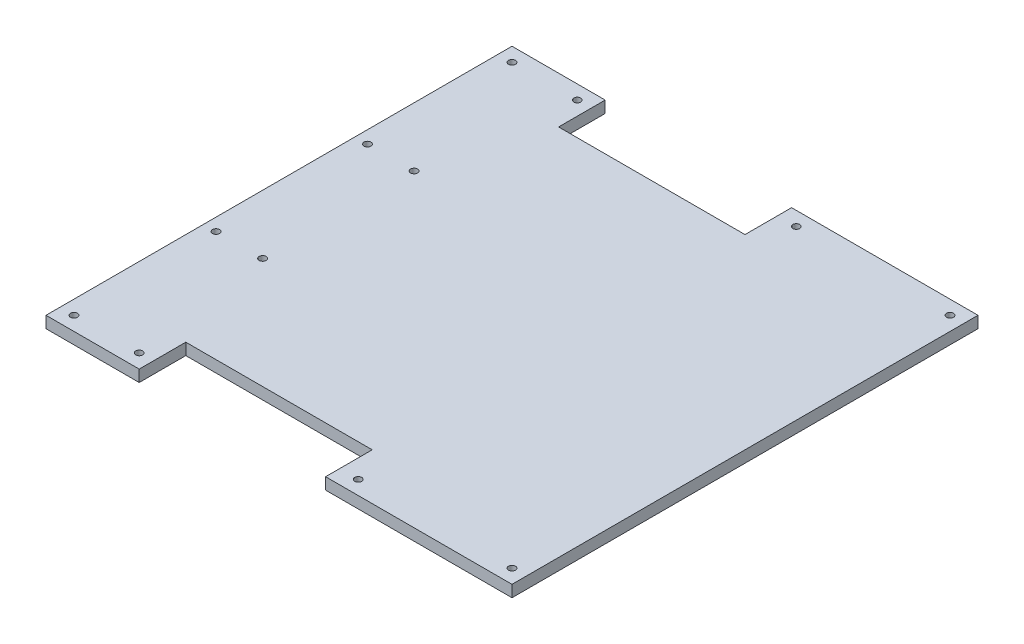
ISO-10303-21;
HEADER;
FILE_DESCRIPTION(('STEP AP214'),'2;1');
FILE_NAME('part.step','',(''),(''),'','','');
FILE_SCHEMA(('AUTOMOTIVE_DESIGN { 1 0 10303 214 1 1 1 1 }'));
ENDSEC;
DATA;
#1=APPLICATION_CONTEXT('core data for automotive mechanical design processes');
#2=APPLICATION_PROTOCOL_DEFINITION('international standard','automotive_design',2000,#1);
#3=PRODUCT_CONTEXT('',#1,'mechanical');
#4=PRODUCT('Part','Part','',(#3));
#5=PRODUCT_RELATED_PRODUCT_CATEGORY('part','',(#4));
#6=PRODUCT_DEFINITION_FORMATION('','',#4);
#7=PRODUCT_DEFINITION_CONTEXT('part definition',#1,'design');
#8=PRODUCT_DEFINITION('design','',#6,#7);
#9=PRODUCT_DEFINITION_SHAPE('','',#8);
#10=(LENGTH_UNIT() NAMED_UNIT(*) SI_UNIT(.MILLI.,.METRE.));
#11=(NAMED_UNIT(*) PLANE_ANGLE_UNIT() SI_UNIT($,.RADIAN.));
#12=(NAMED_UNIT(*) SI_UNIT($,.STERADIAN.) SOLID_ANGLE_UNIT());
#13=UNCERTAINTY_MEASURE_WITH_UNIT(LENGTH_MEASURE(1.E-05),#10,'distance_accuracy_value','');
#14=(GEOMETRIC_REPRESENTATION_CONTEXT(3) GLOBAL_UNCERTAINTY_ASSIGNED_CONTEXT((#13)) GLOBAL_UNIT_ASSIGNED_CONTEXT((#10,
#11,#12)) REPRESENTATION_CONTEXT('',''));
#15=CARTESIAN_POINT('',(0.,0.,0.));
#16=DIRECTION('',(0.,0.,1.));
#17=DIRECTION('',(1.,0.,0.));
#18=AXIS2_PLACEMENT_3D('',#15,#16,#17);
#19=CARTESIAN_POINT('',(27.547169811321,5.,-149.902137597475));
#20=DIRECTION('',(1.,0.,0.));
#21=DIRECTION('',(0.,0.,-1.));
#22=AXIS2_PLACEMENT_3D('',#19,#20,#21);
#23=PLANE('',#22);
#24=DIRECTION('',(0.,0.,1.));
#25=VECTOR('',#24,1.);
#26=CARTESIAN_POINT('',(27.547169811321,0.,-149.902137597475));
#27=LINE('',#26,#25);
#28=CARTESIAN_POINT('',(27.547169811321,0.,-149.902137597475));
#29=VERTEX_POINT('',#28);
#30=CARTESIAN_POINT('',(27.547169811321,0.,50.0978624025251));
#31=VERTEX_POINT('',#30);
#32=EDGE_CURVE('E159',#29,#31,#27,.T.);
#33=ORIENTED_EDGE('',*,*,#32,.T.);
#34=DIRECTION('',(0.,-1.,0.));
#35=VECTOR('',#34,1.);
#36=CARTESIAN_POINT('',(27.547169811321,5.,50.0978624025251));
#37=LINE('',#36,#35);
#38=CARTESIAN_POINT('',(27.547169811321,5.,50.0978624025251));
#39=VERTEX_POINT('',#38);
#40=EDGE_CURVE('E11',#39,#31,#37,.T.);
#41=ORIENTED_EDGE('',*,*,#40,.F.);
#42=DIRECTION('',(0.,0.,1.));
#43=VECTOR('',#42,1.);
#44=CARTESIAN_POINT('',(27.547169811321,5.,-149.902137597475));
#45=LINE('',#44,#43);
#46=CARTESIAN_POINT('',(27.547169811321,5.,-149.902137597475));
#47=VERTEX_POINT('',#46);
#48=EDGE_CURVE('E181',#47,#39,#45,.T.);
#49=ORIENTED_EDGE('',*,*,#48,.F.);
#50=DIRECTION('',(0.,-1.,0.));
#51=VECTOR('',#50,1.);
#52=CARTESIAN_POINT('',(27.547169811321,5.,-149.902137597475));
#53=LINE('',#52,#51);
#54=EDGE_CURVE('E155',#47,#29,#53,.T.);
#55=ORIENTED_EDGE('',*,*,#54,.T.);
#56=EDGE_LOOP('',(#33,#41,#49,#55));
#57=FACE_BOUND('',#56,.T.);
#58=ADVANCED_FACE('F37',(#57),#23,.F.);
#59=CARTESIAN_POINT('',(27.547169811321,5.,50.0978624025251));
#60=DIRECTION('',(0.,0.,-1.));
#61=DIRECTION('',(-1.,0.,0.));
#62=AXIS2_PLACEMENT_3D('',#59,#60,#61);
#63=PLANE('',#62);
#64=DIRECTION('',(1.,0.,0.));
#65=VECTOR('',#64,1.);
#66=CARTESIAN_POINT('',(27.547169811321,0.,50.0978624025251));
#67=LINE('',#66,#65);
#68=CARTESIAN_POINT('',(67.547169811321,0.,50.0978624025251));
#69=VERTEX_POINT('',#68);
#70=EDGE_CURVE('E162',#31,#69,#67,.T.);
#71=ORIENTED_EDGE('',*,*,#70,.T.);
#72=DIRECTION('',(0.,-1.,0.));
#73=VECTOR('',#72,1.);
#74=CARTESIAN_POINT('',(67.547169811321,5.,50.0978624025251));
#75=LINE('',#74,#73);
#76=CARTESIAN_POINT('',(67.547169811321,5.,50.0978624025251));
#77=VERTEX_POINT('',#76);
#78=EDGE_CURVE('E46',#77,#69,#75,.T.);
#79=ORIENTED_EDGE('',*,*,#78,.F.);
#80=DIRECTION('',(1.,0.,0.));
#81=VECTOR('',#80,1.);
#82=CARTESIAN_POINT('',(27.547169811321,5.,50.0978624025251));
#83=LINE('',#82,#81);
#84=EDGE_CURVE('E110',#39,#77,#83,.T.);
#85=ORIENTED_EDGE('',*,*,#84,.F.);
#86=ORIENTED_EDGE('',*,*,#40,.T.);
#87=EDGE_LOOP('',(#71,#79,#85,#86));
#88=FACE_BOUND('',#87,.T.);
#89=ADVANCED_FACE('F251',(#88),#63,.F.);
#90=CARTESIAN_POINT('',(67.547169811321,5.,30.0978624025251));
#91=DIRECTION('',(-1.,0.,0.));
#92=DIRECTION('',(0.,0.,1.));
#93=AXIS2_PLACEMENT_3D('',#90,#91,#92);
#94=PLANE('',#93);
#95=DIRECTION('',(0.,0.,-1.));
#96=VECTOR('',#95,1.);
#97=CARTESIAN_POINT('',(67.547169811321,0.,30.0978624025251));
#98=LINE('',#97,#96);
#99=CARTESIAN_POINT('',(67.547169811321,0.,30.0978624025251));
#100=VERTEX_POINT('',#99);
#101=EDGE_CURVE('E164',#69,#100,#98,.T.);
#102=ORIENTED_EDGE('',*,*,#101,.T.);
#103=DIRECTION('',(0.,-1.,0.));
#104=VECTOR('',#103,1.);
#105=CARTESIAN_POINT('',(67.547169811321,5.,30.0978624025251));
#106=LINE('',#105,#104);
#107=CARTESIAN_POINT('',(67.547169811321,5.,30.0978624025251));
#108=VERTEX_POINT('',#107);
#109=EDGE_CURVE('E200',#108,#100,#106,.T.);
#110=ORIENTED_EDGE('',*,*,#109,.F.);
#111=DIRECTION('',(0.,0.,-1.));
#112=VECTOR('',#111,1.);
#113=CARTESIAN_POINT('',(67.547169811321,5.,30.0978624025251));
#114=LINE('',#113,#112);
#115=EDGE_CURVE('E266',#77,#108,#114,.T.);
#116=ORIENTED_EDGE('',*,*,#115,.F.);
#117=ORIENTED_EDGE('',*,*,#78,.T.);
#118=EDGE_LOOP('',(#102,#110,#116,#117));
#119=FACE_BOUND('',#118,.T.);
#120=ADVANCED_FACE('F256',(#119),#94,.F.);
#121=CARTESIAN_POINT('',(147.547169811321,5.,30.0978624025251));
#122=DIRECTION('',(0.,0.,-1.));
#123=DIRECTION('',(-1.,0.,0.));
#124=AXIS2_PLACEMENT_3D('',#121,#122,#123);
#125=PLANE('',#124);
#126=DIRECTION('',(1.,0.,0.));
#127=VECTOR('',#126,1.);
#128=CARTESIAN_POINT('',(147.547169811321,0.,30.0978624025251));
#129=LINE('',#128,#127);
#130=CARTESIAN_POINT('',(147.547169811321,0.,30.0978624025251));
#131=VERTEX_POINT('',#130);
#132=EDGE_CURVE('E166',#100,#131,#129,.T.);
#133=ORIENTED_EDGE('',*,*,#132,.T.);
#134=DIRECTION('',(0.,-1.,0.));
#135=VECTOR('',#134,1.);
#136=CARTESIAN_POINT('',(147.547169811321,5.,30.0978624025251));
#137=LINE('',#136,#135);
#138=CARTESIAN_POINT('',(147.547169811321,5.,30.0978624025251));
#139=VERTEX_POINT('',#138);
#140=EDGE_CURVE('E197',#139,#131,#137,.T.);
#141=ORIENTED_EDGE('',*,*,#140,.F.);
#142=DIRECTION('',(1.,0.,0.));
#143=VECTOR('',#142,1.);
#144=CARTESIAN_POINT('',(147.547169811321,5.,30.0978624025251));
#145=LINE('',#144,#143);
#146=EDGE_CURVE('E268',#108,#139,#145,.T.);
#147=ORIENTED_EDGE('',*,*,#146,.F.);
#148=ORIENTED_EDGE('',*,*,#109,.T.);
#149=EDGE_LOOP('',(#133,#141,#147,#148));
#150=FACE_BOUND('',#149,.T.);
#151=ADVANCED_FACE('F306',(#150),#125,.F.);
#152=CARTESIAN_POINT('',(147.547169811321,5.,50.0978624025251));
#153=DIRECTION('',(1.,0.,0.));
#154=DIRECTION('',(0.,0.,-1.));
#155=AXIS2_PLACEMENT_3D('',#152,#153,#154);
#156=PLANE('',#155);
#157=DIRECTION('',(0.,0.,1.));
#158=VECTOR('',#157,1.);
#159=CARTESIAN_POINT('',(147.547169811321,0.,50.0978624025251));
#160=LINE('',#159,#158);
#161=CARTESIAN_POINT('',(147.547169811321,0.,50.0978624025251));
#162=VERTEX_POINT('',#161);
#163=EDGE_CURVE('E168',#131,#162,#160,.T.);
#164=ORIENTED_EDGE('',*,*,#163,.T.);
#165=DIRECTION('',(0.,-1.,0.));
#166=VECTOR('',#165,1.);
#167=CARTESIAN_POINT('',(147.547169811321,5.,50.0978624025251));
#168=LINE('',#167,#166);
#169=CARTESIAN_POINT('',(147.547169811321,5.,50.0978624025251));
#170=VERTEX_POINT('',#169);
#171=EDGE_CURVE('E194',#170,#162,#168,.T.);
#172=ORIENTED_EDGE('',*,*,#171,.F.);
#173=DIRECTION('',(0.,0.,1.));
#174=VECTOR('',#173,1.);
#175=CARTESIAN_POINT('',(147.547169811321,5.,50.0978624025251));
#176=LINE('',#175,#174);
#177=EDGE_CURVE('E270',#139,#170,#176,.T.);
#178=ORIENTED_EDGE('',*,*,#177,.F.);
#179=ORIENTED_EDGE('',*,*,#140,.T.);
#180=EDGE_LOOP('',(#164,#172,#178,#179));
#181=FACE_BOUND('',#180,.T.);
#182=ADVANCED_FACE('F303',(#181),#156,.F.);
#183=CARTESIAN_POINT('',(227.547169811321,5.,50.0978624025251));
#184=DIRECTION('',(0.,0.,-1.));
#185=DIRECTION('',(-1.,0.,0.));
#186=AXIS2_PLACEMENT_3D('',#183,#184,#185);
#187=PLANE('',#186);
#188=DIRECTION('',(1.,0.,0.));
#189=VECTOR('',#188,1.);
#190=CARTESIAN_POINT('',(227.547169811321,0.,50.0978624025251));
#191=LINE('',#190,#189);
#192=CARTESIAN_POINT('',(227.547169811321,0.,50.0978624025251));
#193=VERTEX_POINT('',#192);
#194=EDGE_CURVE('E170',#162,#193,#191,.T.);
#195=ORIENTED_EDGE('',*,*,#194,.T.);
#196=DIRECTION('',(0.,-1.,0.));
#197=VECTOR('',#196,1.);
#198=CARTESIAN_POINT('',(227.547169811321,5.,50.0978624025251));
#199=LINE('',#198,#197);
#200=CARTESIAN_POINT('',(227.547169811321,5.,50.0978624025251));
#201=VERTEX_POINT('',#200);
#202=EDGE_CURVE('E191',#201,#193,#199,.T.);
#203=ORIENTED_EDGE('',*,*,#202,.F.);
#204=DIRECTION('',(1.,0.,0.));
#205=VECTOR('',#204,1.);
#206=CARTESIAN_POINT('',(227.547169811321,5.,50.0978624025251));
#207=LINE('',#206,#205);
#208=EDGE_CURVE('E276',#170,#201,#207,.T.);
#209=ORIENTED_EDGE('',*,*,#208,.F.);
#210=ORIENTED_EDGE('',*,*,#171,.T.);
#211=EDGE_LOOP('',(#195,#203,#209,#210));
#212=FACE_BOUND('',#211,.T.);
#213=ADVANCED_FACE('F299',(#212),#187,.F.);
#214=CARTESIAN_POINT('',(227.547169811321,5.,-149.902137597475));
#215=DIRECTION('',(-1.,0.,0.));
#216=DIRECTION('',(0.,0.,1.));
#217=AXIS2_PLACEMENT_3D('',#214,#215,#216);
#218=PLANE('',#217);
#219=DIRECTION('',(0.,0.,-1.));
#220=VECTOR('',#219,1.);
#221=CARTESIAN_POINT('',(227.547169811321,0.,-149.902137597475));
#222=LINE('',#221,#220);
#223=CARTESIAN_POINT('',(227.547169811321,0.,-149.902137597475));
#224=VERTEX_POINT('',#223);
#225=EDGE_CURVE('E172',#193,#224,#222,.T.);
#226=ORIENTED_EDGE('',*,*,#225,.T.);
#227=DIRECTION('',(0.,-1.,0.));
#228=VECTOR('',#227,1.);
#229=CARTESIAN_POINT('',(227.547169811321,5.,-149.902137597475));
#230=LINE('',#229,#228);
#231=CARTESIAN_POINT('',(227.547169811321,5.,-149.902137597475));
#232=VERTEX_POINT('',#231);
#233=EDGE_CURVE('E188',#232,#224,#230,.T.);
#234=ORIENTED_EDGE('',*,*,#233,.F.);
#235=DIRECTION('',(0.,0.,-1.));
#236=VECTOR('',#235,1.);
#237=CARTESIAN_POINT('',(227.547169811321,5.,-149.902137597475));
#238=LINE('',#237,#236);
#239=EDGE_CURVE('E278',#201,#232,#238,.T.);
#240=ORIENTED_EDGE('',*,*,#239,.F.);
#241=ORIENTED_EDGE('',*,*,#202,.T.);
#242=EDGE_LOOP('',(#226,#234,#240,#241));
#243=FACE_BOUND('',#242,.T.);
#244=ADVANCED_FACE('F295',(#243),#218,.F.);
#245=CARTESIAN_POINT('',(147.547169811321,5.,-149.902137597475));
#246=DIRECTION('',(0.,0.,1.));
#247=DIRECTION('',(1.,0.,0.));
#248=AXIS2_PLACEMENT_3D('',#245,#246,#247);
#249=PLANE('',#248);
#250=DIRECTION('',(-1.,0.,0.));
#251=VECTOR('',#250,1.);
#252=CARTESIAN_POINT('',(147.547169811321,0.,-149.902137597475));
#253=LINE('',#252,#251);
#254=CARTESIAN_POINT('',(147.547169811321,0.,-149.902137597475));
#255=VERTEX_POINT('',#254);
#256=EDGE_CURVE('E174',#224,#255,#253,.T.);
#257=ORIENTED_EDGE('',*,*,#256,.T.);
#258=DIRECTION('',(0.,-1.,0.));
#259=VECTOR('',#258,1.);
#260=CARTESIAN_POINT('',(147.547169811321,5.,-149.902137597475));
#261=LINE('',#260,#259);
#262=CARTESIAN_POINT('',(147.547169811321,5.,-149.902137597475));
#263=VERTEX_POINT('',#262);
#264=EDGE_CURVE('E185',#263,#255,#261,.T.);
#265=ORIENTED_EDGE('',*,*,#264,.F.);
#266=DIRECTION('',(-1.,0.,0.));
#267=VECTOR('',#266,1.);
#268=CARTESIAN_POINT('',(147.547169811321,5.,-149.902137597475));
#269=LINE('',#268,#267);
#270=EDGE_CURVE('E280',#232,#263,#269,.T.);
#271=ORIENTED_EDGE('',*,*,#270,.F.);
#272=ORIENTED_EDGE('',*,*,#233,.T.);
#273=EDGE_LOOP('',(#257,#265,#271,#272));
#274=FACE_BOUND('',#273,.T.);
#275=ADVANCED_FACE('F286',(#274),#249,.F.);
#276=CARTESIAN_POINT('',(147.547169811321,5.,-129.902137597475));
#277=DIRECTION('',(1.,0.,0.));
#278=DIRECTION('',(0.,0.,-1.));
#279=AXIS2_PLACEMENT_3D('',#276,#277,#278);
#280=PLANE('',#279);
#281=DIRECTION('',(0.,0.,1.));
#282=VECTOR('',#281,1.);
#283=CARTESIAN_POINT('',(147.547169811321,0.,-129.902137597475));
#284=LINE('',#283,#282);
#285=CARTESIAN_POINT('',(147.547169811321,0.,-129.902137597475));
#286=VERTEX_POINT('',#285);
#287=EDGE_CURVE('E176',#255,#286,#284,.T.);
#288=ORIENTED_EDGE('',*,*,#287,.T.);
#289=DIRECTION('',(0.,-1.,0.));
#290=VECTOR('',#289,1.);
#291=CARTESIAN_POINT('',(147.547169811321,5.,-129.902137597475));
#292=LINE('',#291,#290);
#293=CARTESIAN_POINT('',(147.547169811321,5.,-129.902137597475));
#294=VERTEX_POINT('',#293);
#295=EDGE_CURVE('E150',#294,#286,#292,.T.);
#296=ORIENTED_EDGE('',*,*,#295,.F.);
#297=DIRECTION('',(0.,0.,1.));
#298=VECTOR('',#297,1.);
#299=CARTESIAN_POINT('',(147.547169811321,5.,-129.902137597475));
#300=LINE('',#299,#298);
#301=EDGE_CURVE('E141',#263,#294,#300,.T.);
#302=ORIENTED_EDGE('',*,*,#301,.F.);
#303=ORIENTED_EDGE('',*,*,#264,.T.);
#304=EDGE_LOOP('',(#288,#296,#302,#303));
#305=FACE_BOUND('',#304,.T.);
#306=ADVANCED_FACE('F290',(#305),#280,.F.);
#307=CARTESIAN_POINT('',(67.547169811321,5.,-129.902137597475));
#308=DIRECTION('',(0.,0.,1.));
#309=DIRECTION('',(1.,0.,0.));
#310=AXIS2_PLACEMENT_3D('',#307,#308,#309);
#311=PLANE('',#310);
#312=DIRECTION('',(-1.,0.,0.));
#313=VECTOR('',#312,1.);
#314=CARTESIAN_POINT('',(67.547169811321,0.,-129.902137597475));
#315=LINE('',#314,#313);
#316=CARTESIAN_POINT('',(67.547169811321,0.,-129.902137597475));
#317=VERTEX_POINT('',#316);
#318=EDGE_CURVE('E149',#286,#317,#315,.T.);
#319=ORIENTED_EDGE('',*,*,#318,.T.);
#320=DIRECTION('',(0.,-1.,0.));
#321=VECTOR('',#320,1.);
#322=CARTESIAN_POINT('',(67.547169811321,5.,-129.902137597475));
#323=LINE('',#322,#321);
#324=CARTESIAN_POINT('',(67.547169811321,5.,-129.902137597475));
#325=VERTEX_POINT('',#324);
#326=EDGE_CURVE('E146',#325,#317,#323,.T.);
#327=ORIENTED_EDGE('',*,*,#326,.F.);
#328=DIRECTION('',(-1.,0.,0.));
#329=VECTOR('',#328,1.);
#330=CARTESIAN_POINT('',(67.547169811321,5.,-129.902137597475));
#331=LINE('',#330,#329);
#332=EDGE_CURVE('E135',#294,#325,#331,.T.);
#333=ORIENTED_EDGE('',*,*,#332,.F.);
#334=ORIENTED_EDGE('',*,*,#295,.T.);
#335=EDGE_LOOP('',(#319,#327,#333,#334));
#336=FACE_BOUND('',#335,.T.);
#337=ADVANCED_FACE('F147',(#336),#311,.F.);
#338=CARTESIAN_POINT('',(67.547169811321,5.,-149.902137597475));
#339=DIRECTION('',(-1.,0.,0.));
#340=DIRECTION('',(0.,0.,1.));
#341=AXIS2_PLACEMENT_3D('',#338,#339,#340);
#342=PLANE('',#341);
#343=DIRECTION('',(0.,0.,-1.));
#344=VECTOR('',#343,1.);
#345=CARTESIAN_POINT('',(67.547169811321,0.,-149.902137597475));
#346=LINE('',#345,#344);
#347=CARTESIAN_POINT('',(67.547169811321,0.,-149.902137597475));
#348=VERTEX_POINT('',#347);
#349=EDGE_CURVE('E96',#317,#348,#346,.T.);
#350=ORIENTED_EDGE('',*,*,#349,.T.);
#351=DIRECTION('',(0.,-1.,0.));
#352=VECTOR('',#351,1.);
#353=CARTESIAN_POINT('',(67.547169811321,5.,-149.902137597475));
#354=LINE('',#353,#352);
#355=CARTESIAN_POINT('',(67.547169811321,5.,-149.902137597475));
#356=VERTEX_POINT('',#355);
#357=EDGE_CURVE('E151',#356,#348,#354,.T.);
#358=ORIENTED_EDGE('',*,*,#357,.F.);
#359=DIRECTION('',(0.,0.,-1.));
#360=VECTOR('',#359,1.);
#361=CARTESIAN_POINT('',(67.547169811321,5.,-149.902137597475));
#362=LINE('',#361,#360);
#363=EDGE_CURVE('E139',#325,#356,#362,.T.);
#364=ORIENTED_EDGE('',*,*,#363,.F.);
#365=ORIENTED_EDGE('',*,*,#326,.T.);
#366=EDGE_LOOP('',(#350,#358,#364,#365));
#367=FACE_BOUND('',#366,.T.);
#368=ADVANCED_FACE('F153',(#367),#342,.F.);
#369=CARTESIAN_POINT('',(67.547169811321,5.,-149.902137597475));
#370=DIRECTION('',(0.,0.,1.));
#371=DIRECTION('',(1.,0.,0.));
#372=AXIS2_PLACEMENT_3D('',#369,#370,#371);
#373=PLANE('',#372);
#374=DIRECTION('',(-1.,0.,0.));
#375=VECTOR('',#374,1.);
#376=CARTESIAN_POINT('',(67.547169811321,0.,-149.902137597475));
#377=LINE('',#376,#375);
#378=EDGE_CURVE('E102',#348,#29,#377,.T.);
#379=ORIENTED_EDGE('',*,*,#378,.T.);
#380=ORIENTED_EDGE('',*,*,#54,.F.);
#381=DIRECTION('',(-1.,0.,0.));
#382=VECTOR('',#381,1.);
#383=CARTESIAN_POINT('',(67.547169811321,5.,-149.902137597475));
#384=LINE('',#383,#382);
#385=EDGE_CURVE('E55',#356,#47,#384,.T.);
#386=ORIENTED_EDGE('',*,*,#385,.F.);
#387=ORIENTED_EDGE('',*,*,#357,.T.);
#388=EDGE_LOOP('',(#379,#380,#386,#387));
#389=FACE_BOUND('',#388,.T.);
#390=ADVANCED_FACE('F328',(#389),#373,.F.);
#391=CARTESIAN_POINT('',(0.,5.,0.));
#392=DIRECTION('',(0.,1.,0.));
#393=DIRECTION('',(0.,0.,1.));
#394=AXIS2_PLACEMENT_3D('',#391,#392,#393);
#395=PLANE('',#394);
#396=CARTESIAN_POINT('',(52.9084316566198,5.,-82.5116258627684));
#397=DIRECTION('',(0.,1.,0.));
#398=DIRECTION('',(0.,0.,1.));
#399=AXIS2_PLACEMENT_3D('',#396,#397,#398);
#400=CIRCLE('',#399,1.5);
#401=CARTESIAN_POINT('',(52.9084316566198,5.,-81.0116258627684));
#402=VERTEX_POINT('',#401);
#403=EDGE_CURVE('E413',#402,#402,#400,.T.);
#404=ORIENTED_EDGE('',*,*,#403,.F.);
#405=EDGE_LOOP('',(#404));
#406=FACE_BOUND('',#405,.T.);
#407=CARTESIAN_POINT('',(52.9084316566201,5.,-17.5116258627684));
#408=DIRECTION('',(0.,1.,0.));
#409=DIRECTION('',(0.,0.,1.));
#410=AXIS2_PLACEMENT_3D('',#407,#408,#409);
#411=CIRCLE('',#410,1.5);
#412=CARTESIAN_POINT('',(52.9084316566201,5.,-16.0116258627684));
#413=VERTEX_POINT('',#412);
#414=EDGE_CURVE('E405',#413,#413,#411,.T.);
#415=ORIENTED_EDGE('',*,*,#414,.F.);
#416=EDGE_LOOP('',(#415));
#417=FACE_BOUND('',#416,.T.);
#418=CARTESIAN_POINT('',(32.9084316566201,5.,-17.5116258627687));
#419=DIRECTION('',(0.,1.,0.));
#420=DIRECTION('',(0.,0.,1.));
#421=AXIS2_PLACEMENT_3D('',#418,#419,#420);
#422=CIRCLE('',#421,1.4999999999999);
#423=CARTESIAN_POINT('',(32.9084316566201,5.,-16.0116258627688));
#424=VERTEX_POINT('',#423);
#425=EDGE_CURVE('E398',#424,#424,#422,.T.);
#426=ORIENTED_EDGE('',*,*,#425,.F.);
#427=EDGE_LOOP('',(#426));
#428=FACE_BOUND('',#427,.T.);
#429=CARTESIAN_POINT('',(32.9084316566198,5.,-82.5116258627683));
#430=DIRECTION('',(0.,1.,0.));
#431=DIRECTION('',(0.,0.,1.));
#432=AXIS2_PLACEMENT_3D('',#429,#430,#431);
#433=CIRCLE('',#432,1.5);
#434=CARTESIAN_POINT('',(32.9084316566198,5.,-81.0116258627683));
#435=VERTEX_POINT('',#434);
#436=EDGE_CURVE('E400',#435,#435,#433,.T.);
#437=ORIENTED_EDGE('',*,*,#436,.F.);
#438=EDGE_LOOP('',(#437));
#439=FACE_BOUND('',#438,.T.);
#440=CARTESIAN_POINT('',(155.547169811321,5.,44.0978624025251));
#441=DIRECTION('',(0.,1.,0.));
#442=DIRECTION('',(0.,0.,1.));
#443=AXIS2_PLACEMENT_3D('',#440,#441,#442);
#444=CIRCLE('',#443,1.5);
#445=CARTESIAN_POINT('',(155.547169811321,5.,45.5978624025251));
#446=VERTEX_POINT('',#445);
#447=EDGE_CURVE('E427',#446,#446,#444,.T.);
#448=ORIENTED_EDGE('',*,*,#447,.F.);
#449=EDGE_LOOP('',(#448));
#450=FACE_BOUND('',#449,.T.);
#451=CARTESIAN_POINT('',(61.547169811321,5.,44.0978624025251));
#452=DIRECTION('',(0.,1.,0.));
#453=DIRECTION('',(0.,0.,1.));
#454=AXIS2_PLACEMENT_3D('',#451,#452,#453);
#455=CIRCLE('',#454,1.49999999999999);
#456=CARTESIAN_POINT('',(61.547169811321,5.,45.5978624025251));
#457=VERTEX_POINT('',#456);
#458=EDGE_CURVE('E430',#457,#457,#455,.T.);
#459=ORIENTED_EDGE('',*,*,#458,.F.);
#460=EDGE_LOOP('',(#459));
#461=FACE_BOUND('',#460,.T.);
#462=CARTESIAN_POINT('',(33.547169811321,5.,44.0978624025251));
#463=DIRECTION('',(0.,1.,0.));
#464=DIRECTION('',(0.,0.,1.));
#465=AXIS2_PLACEMENT_3D('',#462,#463,#464);
#466=CIRCLE('',#465,1.5);
#467=CARTESIAN_POINT('',(33.547169811321,5.,45.5978624025251));
#468=VERTEX_POINT('',#467);
#469=EDGE_CURVE('E433',#468,#468,#466,.T.);
#470=ORIENTED_EDGE('',*,*,#469,.F.);
#471=EDGE_LOOP('',(#470));
#472=FACE_BOUND('',#471,.T.);
#473=CARTESIAN_POINT('',(61.547169811321,5.,-143.902137597475));
#474=DIRECTION('',(0.,1.,0.));
#475=DIRECTION('',(0.,0.,1.));
#476=AXIS2_PLACEMENT_3D('',#473,#474,#475);
#477=CIRCLE('',#476,1.49999999999999);
#478=CARTESIAN_POINT('',(61.547169811321,5.,-142.402137597475));
#479=VERTEX_POINT('',#478);
#480=EDGE_CURVE('E357',#479,#479,#477,.T.);
#481=ORIENTED_EDGE('',*,*,#480,.F.);
#482=EDGE_LOOP('',(#481));
#483=FACE_BOUND('',#482,.T.);
#484=CARTESIAN_POINT('',(221.547169811321,5.,-143.902137597475));
#485=DIRECTION('',(0.,1.,0.));
#486=DIRECTION('',(0.,0.,1.));
#487=AXIS2_PLACEMENT_3D('',#484,#485,#486);
#488=CIRCLE('',#487,1.5);
#489=CARTESIAN_POINT('',(221.547169811321,5.,-142.402137597475));
#490=VERTEX_POINT('',#489);
#491=EDGE_CURVE('E420',#490,#490,#488,.T.);
#492=ORIENTED_EDGE('',*,*,#491,.F.);
#493=EDGE_LOOP('',(#492));
#494=FACE_BOUND('',#493,.T.);
#495=CARTESIAN_POINT('',(155.547169811321,5.,-143.902137597475));
#496=DIRECTION('',(0.,1.,0.));
#497=DIRECTION('',(0.,0.,1.));
#498=AXIS2_PLACEMENT_3D('',#495,#496,#497);
#499=CIRCLE('',#498,1.5);
#500=CARTESIAN_POINT('',(155.547169811321,5.,-142.402137597475));
#501=VERTEX_POINT('',#500);
#502=EDGE_CURVE('E424',#501,#501,#499,.T.);
#503=ORIENTED_EDGE('',*,*,#502,.F.);
#504=EDGE_LOOP('',(#503));
#505=FACE_BOUND('',#504,.T.);
#506=CARTESIAN_POINT('',(221.547169811321,5.,44.0978624025251));
#507=DIRECTION('',(0.,1.,0.));
#508=DIRECTION('',(0.,0.,1.));
#509=AXIS2_PLACEMENT_3D('',#506,#507,#508);
#510=CIRCLE('',#509,1.5);
#511=CARTESIAN_POINT('',(221.547169811321,5.,45.5978624025251));
#512=VERTEX_POINT('',#511);
#513=EDGE_CURVE('E425',#512,#512,#510,.T.);
#514=ORIENTED_EDGE('',*,*,#513,.F.);
#515=EDGE_LOOP('',(#514));
#516=FACE_BOUND('',#515,.T.);
#517=CARTESIAN_POINT('',(33.547169811321,5.,-143.902137597475));
#518=DIRECTION('',(0.,1.,0.));
#519=DIRECTION('',(0.,0.,1.));
#520=AXIS2_PLACEMENT_3D('',#517,#518,#519);
#521=CIRCLE('',#520,1.5);
#522=CARTESIAN_POINT('',(33.547169811321,5.,-142.402137597475));
#523=VERTEX_POINT('',#522);
#524=EDGE_CURVE('E209',#523,#523,#521,.T.);
#525=ORIENTED_EDGE('',*,*,#524,.F.);
#526=EDGE_LOOP('',(#525));
#527=FACE_BOUND('',#526,.T.);
#528=ORIENTED_EDGE('',*,*,#48,.T.);
#529=ORIENTED_EDGE('',*,*,#84,.T.);
#530=ORIENTED_EDGE('',*,*,#115,.T.);
#531=ORIENTED_EDGE('',*,*,#146,.T.);
#532=ORIENTED_EDGE('',*,*,#177,.T.);
#533=ORIENTED_EDGE('',*,*,#208,.T.);
#534=ORIENTED_EDGE('',*,*,#239,.T.);
#535=ORIENTED_EDGE('',*,*,#270,.T.);
#536=ORIENTED_EDGE('',*,*,#301,.T.);
#537=ORIENTED_EDGE('',*,*,#332,.T.);
#538=ORIENTED_EDGE('',*,*,#363,.T.);
#539=ORIENTED_EDGE('',*,*,#385,.T.);
#540=EDGE_LOOP('',(#528,#529,#530,#531,#532,#533,#534,#535,#536,#537,#538,#539));
#541=FACE_BOUND('',#540,.T.);
#542=ADVANCED_FACE('F137',(#406,#417,#428,#439,#450,#461,#472,#483,#494,#505,#516,#527,#541),
#395,.T.);
#543=CARTESIAN_POINT('',(0.,0.,0.));
#544=DIRECTION('',(0.,1.,0.));
#545=DIRECTION('',(0.,0.,1.));
#546=AXIS2_PLACEMENT_3D('',#543,#544,#545);
#547=PLANE('',#546);
#548=CARTESIAN_POINT('',(52.9084316566198,0.,-82.5116258627684));
#549=DIRECTION('',(0.,1.,0.));
#550=DIRECTION('',(0.,0.,1.));
#551=AXIS2_PLACEMENT_3D('',#548,#549,#550);
#552=CIRCLE('',#551,1.5);
#553=CARTESIAN_POINT('',(52.9084316566198,0.,-81.0116258627684));
#554=VERTEX_POINT('',#553);
#555=EDGE_CURVE('E416',#554,#554,#552,.T.);
#556=ORIENTED_EDGE('',*,*,#555,.T.);
#557=EDGE_LOOP('',(#556));
#558=FACE_BOUND('',#557,.T.);
#559=CARTESIAN_POINT('',(52.9084316566201,0.,-17.5116258627684));
#560=DIRECTION('',(0.,1.,0.));
#561=DIRECTION('',(0.,0.,1.));
#562=AXIS2_PLACEMENT_3D('',#559,#560,#561);
#563=CIRCLE('',#562,1.5);
#564=CARTESIAN_POINT('',(52.9084316566201,0.,-16.0116258627684));
#565=VERTEX_POINT('',#564);
#566=EDGE_CURVE('E410',#565,#565,#563,.T.);
#567=ORIENTED_EDGE('',*,*,#566,.T.);
#568=EDGE_LOOP('',(#567));
#569=FACE_BOUND('',#568,.T.);
#570=CARTESIAN_POINT('',(32.9084316566201,0.,-17.5116258627687));
#571=DIRECTION('',(0.,1.,0.));
#572=DIRECTION('',(0.,0.,1.));
#573=AXIS2_PLACEMENT_3D('',#570,#571,#572);
#574=CIRCLE('',#573,1.4999999999999);
#575=CARTESIAN_POINT('',(32.9084316566201,0.,-16.0116258627688));
#576=VERTEX_POINT('',#575);
#577=EDGE_CURVE('E395',#576,#576,#574,.T.);
#578=ORIENTED_EDGE('',*,*,#577,.T.);
#579=EDGE_LOOP('',(#578));
#580=FACE_BOUND('',#579,.T.);
#581=CARTESIAN_POINT('',(32.9084316566198,0.,-82.5116258627683));
#582=DIRECTION('',(0.,1.,0.));
#583=DIRECTION('',(0.,0.,1.));
#584=AXIS2_PLACEMENT_3D('',#581,#582,#583);
#585=CIRCLE('',#584,1.5);
#586=CARTESIAN_POINT('',(32.9084316566198,0.,-81.0116258627683));
#587=VERTEX_POINT('',#586);
#588=EDGE_CURVE('E403',#587,#587,#585,.T.);
#589=ORIENTED_EDGE('',*,*,#588,.T.);
#590=EDGE_LOOP('',(#589));
#591=FACE_BOUND('',#590,.T.);
#592=CARTESIAN_POINT('',(155.547169811321,0.,44.0978624025251));
#593=DIRECTION('',(0.,1.,0.));
#594=DIRECTION('',(0.,0.,1.));
#595=AXIS2_PLACEMENT_3D('',#592,#593,#594);
#596=CIRCLE('',#595,1.5);
#597=CARTESIAN_POINT('',(155.547169811321,0.,45.5978624025251));
#598=VERTEX_POINT('',#597);
#599=EDGE_CURVE('E40',#598,#598,#596,.T.);
#600=ORIENTED_EDGE('',*,*,#599,.T.);
#601=EDGE_LOOP('',(#600));
#602=FACE_BOUND('',#601,.T.);
#603=CARTESIAN_POINT('',(61.547169811321,0.,44.0978624025251));
#604=DIRECTION('',(0.,1.,0.));
#605=DIRECTION('',(0.,0.,1.));
#606=AXIS2_PLACEMENT_3D('',#603,#604,#605);
#607=CIRCLE('',#606,1.49999999999999);
#608=CARTESIAN_POINT('',(61.547169811321,0.,45.5978624025251));
#609=VERTEX_POINT('',#608);
#610=EDGE_CURVE('E223',#609,#609,#607,.T.);
#611=ORIENTED_EDGE('',*,*,#610,.T.);
#612=EDGE_LOOP('',(#611));
#613=FACE_BOUND('',#612,.T.);
#614=CARTESIAN_POINT('',(33.547169811321,0.,44.0978624025251));
#615=DIRECTION('',(0.,1.,0.));
#616=DIRECTION('',(0.,0.,1.));
#617=AXIS2_PLACEMENT_3D('',#614,#615,#616);
#618=CIRCLE('',#617,1.5);
#619=CARTESIAN_POINT('',(33.547169811321,0.,45.5978624025251));
#620=VERTEX_POINT('',#619);
#621=EDGE_CURVE('E221',#620,#620,#618,.T.);
#622=ORIENTED_EDGE('',*,*,#621,.T.);
#623=EDGE_LOOP('',(#622));
#624=FACE_BOUND('',#623,.T.);
#625=CARTESIAN_POINT('',(61.547169811321,0.,-143.902137597475));
#626=DIRECTION('',(0.,1.,0.));
#627=DIRECTION('',(0.,0.,1.));
#628=AXIS2_PLACEMENT_3D('',#625,#626,#627);
#629=CIRCLE('',#628,1.49999999999999);
#630=CARTESIAN_POINT('',(61.547169811321,0.,-142.402137597475));
#631=VERTEX_POINT('',#630);
#632=EDGE_CURVE('E218',#631,#631,#629,.T.);
#633=ORIENTED_EDGE('',*,*,#632,.T.);
#634=EDGE_LOOP('',(#633));
#635=FACE_BOUND('',#634,.T.);
#636=CARTESIAN_POINT('',(221.547169811321,0.,-143.902137597475));
#637=DIRECTION('',(0.,1.,0.));
#638=DIRECTION('',(0.,0.,1.));
#639=AXIS2_PLACEMENT_3D('',#636,#637,#638);
#640=CIRCLE('',#639,1.5);
#641=CARTESIAN_POINT('',(221.547169811321,0.,-142.402137597475));
#642=VERTEX_POINT('',#641);
#643=EDGE_CURVE('E215',#642,#642,#640,.T.);
#644=ORIENTED_EDGE('',*,*,#643,.T.);
#645=EDGE_LOOP('',(#644));
#646=FACE_BOUND('',#645,.T.);
#647=CARTESIAN_POINT('',(155.547169811321,0.,-143.902137597475));
#648=DIRECTION('',(0.,1.,0.));
#649=DIRECTION('',(0.,0.,1.));
#650=AXIS2_PLACEMENT_3D('',#647,#648,#649);
#651=CIRCLE('',#650,1.5);
#652=CARTESIAN_POINT('',(155.547169811321,0.,-142.402137597475));
#653=VERTEX_POINT('',#652);
#654=EDGE_CURVE('E212',#653,#653,#651,.T.);
#655=ORIENTED_EDGE('',*,*,#654,.T.);
#656=EDGE_LOOP('',(#655));
#657=FACE_BOUND('',#656,.T.);
#658=CARTESIAN_POINT('',(221.547169811321,0.,44.0978624025251));
#659=DIRECTION('',(0.,1.,0.));
#660=DIRECTION('',(0.,0.,1.));
#661=AXIS2_PLACEMENT_3D('',#658,#659,#660);
#662=CIRCLE('',#661,1.5);
#663=CARTESIAN_POINT('',(221.547169811321,0.,45.5978624025251));
#664=VERTEX_POINT('',#663);
#665=EDGE_CURVE('E208',#664,#664,#662,.T.);
#666=ORIENTED_EDGE('',*,*,#665,.T.);
#667=EDGE_LOOP('',(#666));
#668=FACE_BOUND('',#667,.T.);
#669=CARTESIAN_POINT('',(33.547169811321,0.,-143.902137597475));
#670=DIRECTION('',(0.,1.,0.));
#671=DIRECTION('',(0.,0.,1.));
#672=AXIS2_PLACEMENT_3D('',#669,#670,#671);
#673=CIRCLE('',#672,1.5);
#674=CARTESIAN_POINT('',(33.547169811321,0.,-142.402137597475));
#675=VERTEX_POINT('',#674);
#676=EDGE_CURVE('E205',#675,#675,#673,.T.);
#677=ORIENTED_EDGE('',*,*,#676,.T.);
#678=EDGE_LOOP('',(#677));
#679=FACE_BOUND('',#678,.T.);
#680=ORIENTED_EDGE('',*,*,#32,.F.);
#681=ORIENTED_EDGE('',*,*,#378,.F.);
#682=ORIENTED_EDGE('',*,*,#349,.F.);
#683=ORIENTED_EDGE('',*,*,#318,.F.);
#684=ORIENTED_EDGE('',*,*,#287,.F.);
#685=ORIENTED_EDGE('',*,*,#256,.F.);
#686=ORIENTED_EDGE('',*,*,#225,.F.);
#687=ORIENTED_EDGE('',*,*,#194,.F.);
#688=ORIENTED_EDGE('',*,*,#163,.F.);
#689=ORIENTED_EDGE('',*,*,#132,.F.);
#690=ORIENTED_EDGE('',*,*,#101,.F.);
#691=ORIENTED_EDGE('',*,*,#70,.F.);
#692=EDGE_LOOP('',(#680,#681,#682,#683,#684,#685,#686,#687,#688,#689,#690,#691));
#693=FACE_BOUND('',#692,.T.);
#694=ADVANCED_FACE('F230',(#558,#569,#580,#591,#602,#613,#624,#635,#646,#657,#668,#679,#693),
#547,.F.);
#695=CARTESIAN_POINT('',(33.547169811321,-15.,-143.902137597475));
#696=DIRECTION('',(0.,1.,0.));
#697=DIRECTION('',(0.,0.,1.));
#698=AXIS2_PLACEMENT_3D('',#695,#696,#697);
#699=CYLINDRICAL_SURFACE('',#698,1.5);
#700=ORIENTED_EDGE('',*,*,#524,.T.);
#701=EDGE_LOOP('',(#700));
#702=FACE_BOUND('',#701,.T.);
#703=ORIENTED_EDGE('',*,*,#676,.F.);
#704=EDGE_LOOP('',(#703));
#705=FACE_BOUND('',#704,.T.);
#706=ADVANCED_FACE('F333',(#702,#705),#699,.F.);
#707=CARTESIAN_POINT('',(221.547169811321,-15.,44.0978624025251));
#708=DIRECTION('',(0.,1.,0.));
#709=DIRECTION('',(0.,0.,1.));
#710=AXIS2_PLACEMENT_3D('',#707,#708,#709);
#711=CYLINDRICAL_SURFACE('',#710,1.5);
#712=ORIENTED_EDGE('',*,*,#513,.T.);
#713=EDGE_LOOP('',(#712));
#714=FACE_BOUND('',#713,.T.);
#715=ORIENTED_EDGE('',*,*,#665,.F.);
#716=EDGE_LOOP('',(#715));
#717=FACE_BOUND('',#716,.T.);
#718=ADVANCED_FACE('F340',(#714,#717),#711,.F.);
#719=CARTESIAN_POINT('',(155.547169811321,-15.,-143.902137597475));
#720=DIRECTION('',(0.,1.,0.));
#721=DIRECTION('',(0.,0.,1.));
#722=AXIS2_PLACEMENT_3D('',#719,#720,#721);
#723=CYLINDRICAL_SURFACE('',#722,1.5);
#724=ORIENTED_EDGE('',*,*,#502,.T.);
#725=EDGE_LOOP('',(#724));
#726=FACE_BOUND('',#725,.T.);
#727=ORIENTED_EDGE('',*,*,#654,.F.);
#728=EDGE_LOOP('',(#727));
#729=FACE_BOUND('',#728,.T.);
#730=ADVANCED_FACE('F351',(#726,#729),#723,.F.);
#731=CARTESIAN_POINT('',(221.547169811321,-15.,-143.902137597475));
#732=DIRECTION('',(0.,1.,0.));
#733=DIRECTION('',(0.,0.,1.));
#734=AXIS2_PLACEMENT_3D('',#731,#732,#733);
#735=CYLINDRICAL_SURFACE('',#734,1.5);
#736=ORIENTED_EDGE('',*,*,#491,.T.);
#737=EDGE_LOOP('',(#736));
#738=FACE_BOUND('',#737,.T.);
#739=ORIENTED_EDGE('',*,*,#643,.F.);
#740=EDGE_LOOP('',(#739));
#741=FACE_BOUND('',#740,.T.);
#742=ADVANCED_FACE('F346',(#738,#741),#735,.F.);
#743=CARTESIAN_POINT('',(61.547169811321,-15.,-143.902137597475));
#744=DIRECTION('',(0.,1.,0.));
#745=DIRECTION('',(0.,0.,1.));
#746=AXIS2_PLACEMENT_3D('',#743,#744,#745);
#747=CYLINDRICAL_SURFACE('',#746,1.49999999999999);
#748=ORIENTED_EDGE('',*,*,#480,.T.);
#749=EDGE_LOOP('',(#748));
#750=FACE_BOUND('',#749,.T.);
#751=ORIENTED_EDGE('',*,*,#632,.F.);
#752=EDGE_LOOP('',(#751));
#753=FACE_BOUND('',#752,.T.);
#754=ADVANCED_FACE('F343',(#750,#753),#747,.F.);
#755=CARTESIAN_POINT('',(33.547169811321,-15.,44.0978624025251));
#756=DIRECTION('',(0.,1.,0.));
#757=DIRECTION('',(0.,0.,1.));
#758=AXIS2_PLACEMENT_3D('',#755,#756,#757);
#759=CYLINDRICAL_SURFACE('',#758,1.5);
#760=ORIENTED_EDGE('',*,*,#469,.T.);
#761=EDGE_LOOP('',(#760));
#762=FACE_BOUND('',#761,.T.);
#763=ORIENTED_EDGE('',*,*,#621,.F.);
#764=EDGE_LOOP('',(#763));
#765=FACE_BOUND('',#764,.T.);
#766=ADVANCED_FACE('F245',(#762,#765),#759,.F.);
#767=CARTESIAN_POINT('',(61.547169811321,-15.,44.0978624025251));
#768=DIRECTION('',(0.,1.,0.));
#769=DIRECTION('',(0.,0.,1.));
#770=AXIS2_PLACEMENT_3D('',#767,#768,#769);
#771=CYLINDRICAL_SURFACE('',#770,1.49999999999999);
#772=ORIENTED_EDGE('',*,*,#458,.T.);
#773=EDGE_LOOP('',(#772));
#774=FACE_BOUND('',#773,.T.);
#775=ORIENTED_EDGE('',*,*,#610,.F.);
#776=EDGE_LOOP('',(#775));
#777=FACE_BOUND('',#776,.T.);
#778=ADVANCED_FACE('F235',(#774,#777),#771,.F.);
#779=CARTESIAN_POINT('',(155.547169811321,-15.,44.0978624025251));
#780=DIRECTION('',(0.,1.,0.));
#781=DIRECTION('',(0.,0.,1.));
#782=AXIS2_PLACEMENT_3D('',#779,#780,#781);
#783=CYLINDRICAL_SURFACE('',#782,1.5);
#784=ORIENTED_EDGE('',*,*,#447,.T.);
#785=EDGE_LOOP('',(#784));
#786=FACE_BOUND('',#785,.T.);
#787=ORIENTED_EDGE('',*,*,#599,.F.);
#788=EDGE_LOOP('',(#787));
#789=FACE_BOUND('',#788,.T.);
#790=ADVANCED_FACE('F232',(#786,#789),#783,.F.);
#791=CARTESIAN_POINT('',(32.9084316566198,0.,-82.5116258627683));
#792=DIRECTION('',(0.,1.,0.));
#793=DIRECTION('',(0.,0.,1.));
#794=AXIS2_PLACEMENT_3D('',#791,#792,#793);
#795=CYLINDRICAL_SURFACE('',#794,1.5);
#796=ORIENTED_EDGE('',*,*,#588,.F.);
#797=EDGE_LOOP('',(#796));
#798=FACE_BOUND('',#797,.T.);
#799=ORIENTED_EDGE('',*,*,#436,.T.);
#800=EDGE_LOOP('',(#799));
#801=FACE_BOUND('',#800,.T.);
#802=ADVANCED_FACE('F234',(#798,#801),#795,.F.);
#803=CARTESIAN_POINT('',(32.9084316566201,0.,-17.5116258627687));
#804=DIRECTION('',(0.,1.,0.));
#805=DIRECTION('',(0.,0.,1.));
#806=AXIS2_PLACEMENT_3D('',#803,#804,#805);
#807=CYLINDRICAL_SURFACE('',#806,1.4999999999999);
#808=ORIENTED_EDGE('',*,*,#577,.F.);
#809=EDGE_LOOP('',(#808));
#810=FACE_BOUND('',#809,.T.);
#811=ORIENTED_EDGE('',*,*,#425,.T.);
#812=EDGE_LOOP('',(#811));
#813=FACE_BOUND('',#812,.T.);
#814=ADVANCED_FACE('F242',(#810,#813),#807,.F.);
#815=CARTESIAN_POINT('',(52.9084316566201,0.,-17.5116258627684));
#816=DIRECTION('',(0.,1.,0.));
#817=DIRECTION('',(0.,0.,1.));
#818=AXIS2_PLACEMENT_3D('',#815,#816,#817);
#819=CYLINDRICAL_SURFACE('',#818,1.5);
#820=ORIENTED_EDGE('',*,*,#566,.F.);
#821=EDGE_LOOP('',(#820));
#822=FACE_BOUND('',#821,.T.);
#823=ORIENTED_EDGE('',*,*,#414,.T.);
#824=EDGE_LOOP('',(#823));
#825=FACE_BOUND('',#824,.T.);
#826=ADVANCED_FACE('F383',(#822,#825),#819,.F.);
#827=CARTESIAN_POINT('',(52.9084316566198,0.,-82.5116258627684));
#828=DIRECTION('',(0.,1.,0.));
#829=DIRECTION('',(0.,0.,1.));
#830=AXIS2_PLACEMENT_3D('',#827,#828,#829);
#831=CYLINDRICAL_SURFACE('',#830,1.5);
#832=ORIENTED_EDGE('',*,*,#555,.F.);
#833=EDGE_LOOP('',(#832));
#834=FACE_BOUND('',#833,.T.);
#835=ORIENTED_EDGE('',*,*,#403,.T.);
#836=EDGE_LOOP('',(#835));
#837=FACE_BOUND('',#836,.T.);
#838=ADVANCED_FACE('F380',(#834,#837),#831,.F.);
#839=CLOSED_SHELL('',(#58,#89,#120,#151,#182,#213,#244,#275,#306,#337,#368,#390,#542,#694,#706,
#718,#730,#742,#754,#766,#778,#790,#802,#814,#826,#838));
#840=MANIFOLD_SOLID_BREP('B2',#839);
#841=ADVANCED_BREP_SHAPE_REPRESENTATION('',(#18,#840),#14);
#842=SHAPE_DEFINITION_REPRESENTATION(#9,#841);
ENDSEC;
END-ISO-10303-21;
